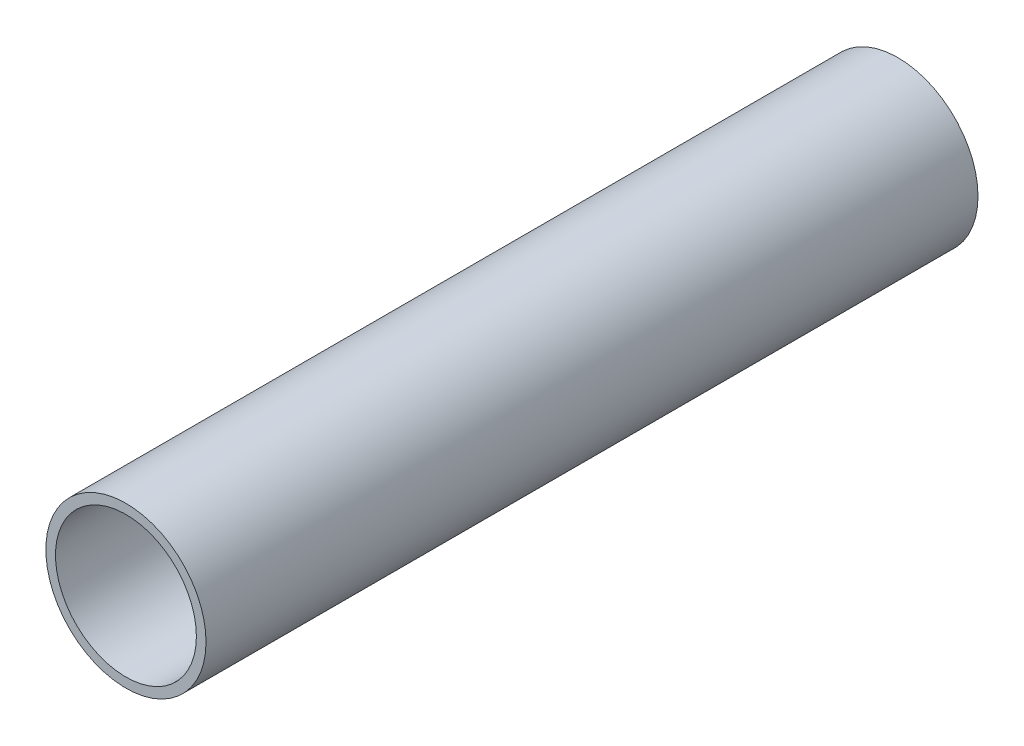
ISO-10303-21;
HEADER;
FILE_DESCRIPTION(('STEP AP214'),'2;1');
FILE_NAME('part.step','',(''),(''),'','','');
FILE_SCHEMA(('AUTOMOTIVE_DESIGN { 1 0 10303 214 1 1 1 1 }'));
ENDSEC;
DATA;
#1=APPLICATION_CONTEXT('core data for automotive mechanical design processes');
#2=APPLICATION_PROTOCOL_DEFINITION('international standard','automotive_design',2000,#1);
#3=PRODUCT_CONTEXT('',#1,'mechanical');
#4=PRODUCT('Part','Part','',(#3));
#5=PRODUCT_RELATED_PRODUCT_CATEGORY('part','',(#4));
#6=PRODUCT_DEFINITION_FORMATION('','',#4);
#7=PRODUCT_DEFINITION_CONTEXT('part definition',#1,'design');
#8=PRODUCT_DEFINITION('design','',#6,#7);
#9=PRODUCT_DEFINITION_SHAPE('','',#8);
#10=(LENGTH_UNIT() NAMED_UNIT(*) SI_UNIT(.MILLI.,.METRE.));
#11=(NAMED_UNIT(*) PLANE_ANGLE_UNIT() SI_UNIT($,.RADIAN.));
#12=(NAMED_UNIT(*) SI_UNIT($,.STERADIAN.) SOLID_ANGLE_UNIT());
#13=UNCERTAINTY_MEASURE_WITH_UNIT(LENGTH_MEASURE(1.E-05),#10,'distance_accuracy_value','');
#14=(GEOMETRIC_REPRESENTATION_CONTEXT(3) GLOBAL_UNCERTAINTY_ASSIGNED_CONTEXT((#13)) GLOBAL_UNIT_ASSIGNED_CONTEXT((#10,
#11,#12)) REPRESENTATION_CONTEXT('',''));
#15=CARTESIAN_POINT('',(0.,0.,0.));
#16=DIRECTION('',(0.,0.,1.));
#17=DIRECTION('',(1.,0.,0.));
#18=AXIS2_PLACEMENT_3D('',#15,#16,#17);
#19=CARTESIAN_POINT('',(0.,0.,400.));
#20=DIRECTION('',(0.,0.,1.));
#21=DIRECTION('',(1.,0.,0.));
#22=AXIS2_PLACEMENT_3D('',#19,#20,#21);
#23=PLANE('',#22);
#24=CARTESIAN_POINT('',(0.,0.,400.));
#25=DIRECTION('',(0.,0.,1.));
#26=DIRECTION('',(1.,0.,0.));
#27=AXIS2_PLACEMENT_3D('',#24,#25,#26);
#28=CIRCLE('',#27,41.5);
#29=CARTESIAN_POINT('',(41.5,0.,400.));
#30=VERTEX_POINT('',#29);
#31=EDGE_CURVE('E10',#30,#30,#28,.T.);
#32=ORIENTED_EDGE('',*,*,#31,.T.);
#33=EDGE_LOOP('',(#32));
#34=FACE_BOUND('',#33,.T.);
#35=CARTESIAN_POINT('',(0.,0.,400.));
#36=DIRECTION('',(0.,0.,1.));
#37=DIRECTION('',(1.,0.,0.));
#38=AXIS2_PLACEMENT_3D('',#35,#36,#37);
#39=CIRCLE('',#38,36.5);
#40=CARTESIAN_POINT('',(36.5,0.,400.));
#41=VERTEX_POINT('',#40);
#42=EDGE_CURVE('E54',#41,#41,#39,.T.);
#43=ORIENTED_EDGE('',*,*,#42,.F.);
#44=EDGE_LOOP('',(#43));
#45=FACE_BOUND('',#44,.T.);
#46=ADVANCED_FACE('F41',(#34,#45),#23,.T.);
#47=CARTESIAN_POINT('',(0.,0.,0.));
#48=DIRECTION('',(0.,0.,1.));
#49=DIRECTION('',(1.,0.,0.));
#50=AXIS2_PLACEMENT_3D('',#47,#48,#49);
#51=PLANE('',#50);
#52=CARTESIAN_POINT('',(0.,0.,0.));
#53=DIRECTION('',(0.,0.,1.));
#54=DIRECTION('',(1.,0.,0.));
#55=AXIS2_PLACEMENT_3D('',#52,#53,#54);
#56=CIRCLE('',#55,41.5);
#57=CARTESIAN_POINT('',(41.5,0.,0.));
#58=VERTEX_POINT('',#57);
#59=EDGE_CURVE('E45',#58,#58,#56,.T.);
#60=ORIENTED_EDGE('',*,*,#59,.F.);
#61=EDGE_LOOP('',(#60));
#62=FACE_BOUND('',#61,.T.);
#63=CARTESIAN_POINT('',(0.,0.,0.));
#64=DIRECTION('',(0.,0.,1.));
#65=DIRECTION('',(1.,0.,0.));
#66=AXIS2_PLACEMENT_3D('',#63,#64,#65);
#67=CIRCLE('',#66,36.5);
#68=CARTESIAN_POINT('',(36.5,0.,0.));
#69=VERTEX_POINT('',#68);
#70=EDGE_CURVE('E56',#69,#69,#67,.T.);
#71=ORIENTED_EDGE('',*,*,#70,.T.);
#72=EDGE_LOOP('',(#71));
#73=FACE_BOUND('',#72,.T.);
#74=ADVANCED_FACE('F68',(#62,#73),#51,.F.);
#75=CARTESIAN_POINT('',(0.,0.,400.));
#76=DIRECTION('',(0.,0.,-1.));
#77=DIRECTION('',(-1.,0.,0.));
#78=AXIS2_PLACEMENT_3D('',#75,#76,#77);
#79=CYLINDRICAL_SURFACE('',#78,41.5);
#80=ORIENTED_EDGE('',*,*,#31,.F.);
#81=EDGE_LOOP('',(#80));
#82=FACE_BOUND('',#81,.T.);
#83=ORIENTED_EDGE('',*,*,#59,.T.);
#84=EDGE_LOOP('',(#83));
#85=FACE_BOUND('',#84,.T.);
#86=ADVANCED_FACE('F43',(#82,#85),#79,.T.);
#87=CARTESIAN_POINT('',(0.,0.,400.));
#88=DIRECTION('',(0.,0.,-1.));
#89=DIRECTION('',(-1.,0.,0.));
#90=AXIS2_PLACEMENT_3D('',#87,#88,#89);
#91=CYLINDRICAL_SURFACE('',#90,36.5);
#92=ORIENTED_EDGE('',*,*,#42,.T.);
#93=EDGE_LOOP('',(#92));
#94=FACE_BOUND('',#93,.T.);
#95=ORIENTED_EDGE('',*,*,#70,.F.);
#96=EDGE_LOOP('',(#95));
#97=FACE_BOUND('',#96,.T.);
#98=ADVANCED_FACE('F64',(#94,#97),#91,.F.);
#99=CLOSED_SHELL('',(#46,#74,#86,#98));
#100=MANIFOLD_SOLID_BREP('B2',#99);
#101=ADVANCED_BREP_SHAPE_REPRESENTATION('',(#18,#100),#14);
#102=SHAPE_DEFINITION_REPRESENTATION(#9,#101);
ENDSEC;
END-ISO-10303-21;
